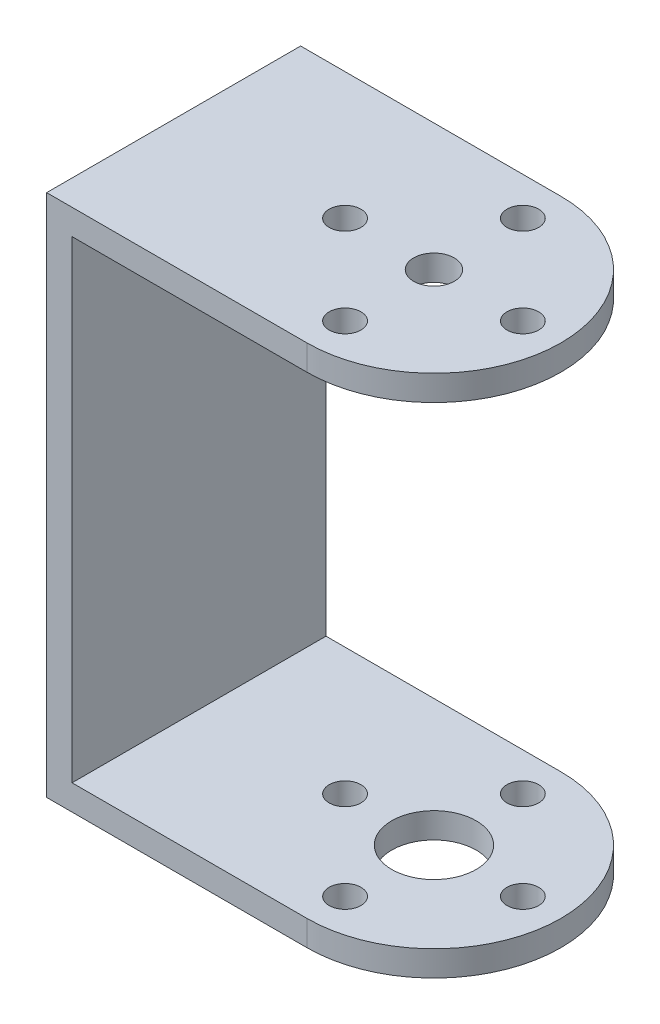
ISO-10303-21;
HEADER;
FILE_DESCRIPTION(('STEP AP214'),'2;1');
FILE_NAME('part.step','',(''),(''),'','','');
FILE_SCHEMA(('AUTOMOTIVE_DESIGN { 1 0 10303 214 1 1 1 1 }'));
ENDSEC;
DATA;
#1=APPLICATION_CONTEXT('core data for automotive mechanical design processes');
#2=APPLICATION_PROTOCOL_DEFINITION('international standard','automotive_design',2000,#1);
#3=PRODUCT_CONTEXT('',#1,'mechanical');
#4=PRODUCT('Part','Part','',(#3));
#5=PRODUCT_RELATED_PRODUCT_CATEGORY('part','',(#4));
#6=PRODUCT_DEFINITION_FORMATION('','',#4);
#7=PRODUCT_DEFINITION_CONTEXT('part definition',#1,'design');
#8=PRODUCT_DEFINITION('design','',#6,#7);
#9=PRODUCT_DEFINITION_SHAPE('','',#8);
#10=(LENGTH_UNIT() NAMED_UNIT(*) SI_UNIT(.MILLI.,.METRE.));
#11=(NAMED_UNIT(*) PLANE_ANGLE_UNIT() SI_UNIT($,.RADIAN.));
#12=(NAMED_UNIT(*) SI_UNIT($,.STERADIAN.) SOLID_ANGLE_UNIT());
#13=UNCERTAINTY_MEASURE_WITH_UNIT(LENGTH_MEASURE(1.E-05),#10,'distance_accuracy_value','');
#14=(GEOMETRIC_REPRESENTATION_CONTEXT(3) GLOBAL_UNCERTAINTY_ASSIGNED_CONTEXT((#13)) GLOBAL_UNIT_ASSIGNED_CONTEXT((#10,
#11,#12)) REPRESENTATION_CONTEXT('',''));
#15=CARTESIAN_POINT('',(0.,0.,0.));
#16=DIRECTION('',(0.,0.,1.));
#17=DIRECTION('',(1.,0.,0.));
#18=AXIS2_PLACEMENT_3D('',#15,#16,#17);
#19=CARTESIAN_POINT('',(-50.,11.6,10.0000001490116));
#20=DIRECTION('',(0.,1.,0.));
#21=DIRECTION('',(1.,0.,0.));
#22=AXIS2_PLACEMENT_3D('',#19,#20,#21);
#23=PLANE('',#22);
#24=CARTESIAN_POINT('',(-25.5,11.6,-7.0000018731));
#25=DIRECTION('',(0.,-1.,0.));
#26=DIRECTION('',(1.,0.,0.));
#27=AXIS2_PLACEMENT_3D('',#24,#25,#26);
#28=CIRCLE('',#27,1.25);
#29=CARTESIAN_POINT('',(-24.25,11.6,-7.0000018731));
#30=VERTEX_POINT('',#29);
#31=EDGE_CURVE('E240',#30,#30,#28,.T.);
#32=ORIENTED_EDGE('',*,*,#31,.T.);
#33=EDGE_LOOP('',(#32));
#34=FACE_BOUND('',#33,.T.);
#35=CARTESIAN_POINT('',(-25.5,11.6,7.0000018731));
#36=DIRECTION('',(0.,-1.,0.));
#37=DIRECTION('',(1.,0.,0.));
#38=AXIS2_PLACEMENT_3D('',#35,#36,#37);
#39=CIRCLE('',#38,1.25);
#40=CARTESIAN_POINT('',(-24.25,11.6,7.0000018731));
#41=VERTEX_POINT('',#40);
#42=EDGE_CURVE('E244',#41,#41,#39,.T.);
#43=ORIENTED_EDGE('',*,*,#42,.T.);
#44=EDGE_LOOP('',(#43));
#45=FACE_BOUND('',#44,.T.);
#46=CARTESIAN_POINT('',(-32.5000018731,11.6,0.));
#47=DIRECTION('',(0.,-1.,0.));
#48=DIRECTION('',(1.,0.,0.));
#49=AXIS2_PLACEMENT_3D('',#46,#47,#48);
#50=CIRCLE('',#49,1.25);
#51=CARTESIAN_POINT('',(-31.2500018731,11.6,0.));
#52=VERTEX_POINT('',#51);
#53=EDGE_CURVE('E266',#52,#52,#50,.T.);
#54=ORIENTED_EDGE('',*,*,#53,.T.);
#55=EDGE_LOOP('',(#54));
#56=FACE_BOUND('',#55,.T.);
#57=CARTESIAN_POINT('',(-25.5,11.6,0.));
#58=DIRECTION('',(0.,-1.,0.));
#59=DIRECTION('',(1.,0.,0.));
#60=AXIS2_PLACEMENT_3D('',#57,#58,#59);
#61=CIRCLE('',#60,1.6);
#62=CARTESIAN_POINT('',(-23.9,11.6,0.));
#63=VERTEX_POINT('',#62);
#64=EDGE_CURVE('E262',#63,#63,#61,.T.);
#65=ORIENTED_EDGE('',*,*,#64,.T.);
#66=EDGE_LOOP('',(#65));
#67=FACE_BOUND('',#66,.T.);
#68=CARTESIAN_POINT('',(-18.4999981269,11.6,0.));
#69=DIRECTION('',(0.,-1.,0.));
#70=DIRECTION('',(1.,0.,0.));
#71=AXIS2_PLACEMENT_3D('',#68,#69,#70);
#72=CIRCLE('',#71,1.25);
#73=CARTESIAN_POINT('',(-17.2499981269,11.6,0.));
#74=VERTEX_POINT('',#73);
#75=EDGE_CURVE('E258',#74,#74,#72,.T.);
#76=ORIENTED_EDGE('',*,*,#75,.T.);
#77=EDGE_LOOP('',(#76));
#78=FACE_BOUND('',#77,.T.);
#79=DIRECTION('',(1.,-3.89254814322436E-09,0.));
#80=VECTOR('',#79,1.);
#81=CARTESIAN_POINT('',(-50.,11.6000000953674,10.0000001490116));
#82=LINE('',#81,#80);
#83=CARTESIAN_POINT('',(-46.,11.6,10.0000001490116));
#84=VERTEX_POINT('',#83);
#85=CARTESIAN_POINT('',(-25.5,11.6,10.0000001490116));
#86=VERTEX_POINT('',#85);
#87=EDGE_CURVE('E223',#84,#86,#82,.T.);
#88=ORIENTED_EDGE('',*,*,#87,.T.);
#89=CARTESIAN_POINT('',(-25.5,11.6,0.));
#90=DIRECTION('',(0.,1.,0.));
#91=DIRECTION('',(-1.,0.,0.));
#92=AXIS2_PLACEMENT_3D('',#89,#90,#91);
#93=CIRCLE('',#92,10.);
#94=CARTESIAN_POINT('',(-25.5,11.6,-10.));
#95=VERTEX_POINT('',#94);
#96=EDGE_CURVE('E10',#86,#95,#93,.T.);
#97=ORIENTED_EDGE('',*,*,#96,.T.);
#98=DIRECTION('',(-1.,0.,0.));
#99=VECTOR('',#98,1.);
#100=CARTESIAN_POINT('',(-44.,11.6,-10.0000001490116));
#101=LINE('',#100,#99);
#102=CARTESIAN_POINT('',(-46.,11.6,-10.0000001490116));
#103=VERTEX_POINT('',#102);
#104=EDGE_CURVE('E36',#95,#103,#101,.T.);
#105=ORIENTED_EDGE('',*,*,#104,.T.);
#106=DIRECTION('',(0.,0.,-1.));
#107=VECTOR('',#106,1.);
#108=CARTESIAN_POINT('',(-46.,11.6,-10.0000001490116));
#109=LINE('',#108,#107);
#110=EDGE_CURVE('E212',#84,#103,#109,.T.);
#111=ORIENTED_EDGE('',*,*,#110,.F.);
#112=EDGE_LOOP('',(#88,#97,#105,#111));
#113=FACE_BOUND('',#112,.T.);
#114=ADVANCED_FACE('F16',(#34,#45,#56,#67,#78,#113),#23,.T.);
#115=CARTESIAN_POINT('',(-25.5,9.6,0.));
#116=DIRECTION('',(0.,1.,0.));
#117=DIRECTION('',(1.,0.,0.));
#118=AXIS2_PLACEMENT_3D('',#115,#116,#117);
#119=CYLINDRICAL_SURFACE('',#118,10.);
#120=CARTESIAN_POINT('',(-25.5,9.6,0.));
#121=DIRECTION('',(0.,1.,0.));
#122=DIRECTION('',(-1.,0.,0.));
#123=AXIS2_PLACEMENT_3D('',#120,#121,#122);
#124=CIRCLE('',#123,10.);
#125=CARTESIAN_POINT('',(-25.5,9.6,10.0000001490116));
#126=VERTEX_POINT('',#125);
#127=CARTESIAN_POINT('',(-25.5,9.6,-10.));
#128=VERTEX_POINT('',#127);
#129=EDGE_CURVE('E236',#126,#128,#124,.T.);
#130=ORIENTED_EDGE('',*,*,#129,.T.);
#131=DIRECTION('',(0.,1.,0.));
#132=VECTOR('',#131,1.);
#133=CARTESIAN_POINT('',(-25.5,9.6,-10.));
#134=LINE('',#133,#132);
#135=EDGE_CURVE('E24',#128,#95,#134,.T.);
#136=ORIENTED_EDGE('',*,*,#135,.T.);
#137=ORIENTED_EDGE('',*,*,#96,.F.);
#138=DIRECTION('',(0.,1.,0.));
#139=VECTOR('',#138,1.);
#140=CARTESIAN_POINT('',(-25.5,9.6,10.0000001490116));
#141=LINE('',#140,#139);
#142=EDGE_CURVE('E219',#126,#86,#141,.T.);
#143=ORIENTED_EDGE('',*,*,#142,.F.);
#144=EDGE_LOOP('',(#130,#136,#137,#143));
#145=FACE_BOUND('',#144,.T.);
#146=ADVANCED_FACE('F276',(#145),#119,.T.);
#147=CARTESIAN_POINT('',(-25.5,9.6,-7.0000018731));
#148=DIRECTION('',(0.,1.,0.));
#149=DIRECTION('',(1.,0.,0.));
#150=AXIS2_PLACEMENT_3D('',#147,#148,#149);
#151=CYLINDRICAL_SURFACE('',#150,1.25);
#152=CARTESIAN_POINT('',(-25.5,9.6,-7.0000018731));
#153=DIRECTION('',(0.,-1.,0.));
#154=DIRECTION('',(1.,0.,0.));
#155=AXIS2_PLACEMENT_3D('',#152,#153,#154);
#156=CIRCLE('',#155,1.25);
#157=CARTESIAN_POINT('',(-24.25,9.6,-7.0000018731));
#158=VERTEX_POINT('',#157);
#159=EDGE_CURVE('E254',#158,#158,#156,.T.);
#160=ORIENTED_EDGE('',*,*,#159,.T.);
#161=EDGE_LOOP('',(#160));
#162=FACE_BOUND('',#161,.T.);
#163=ORIENTED_EDGE('',*,*,#31,.F.);
#164=EDGE_LOOP('',(#163));
#165=FACE_BOUND('',#164,.T.);
#166=ADVANCED_FACE('F299',(#162,#165),#151,.F.);
#167=CARTESIAN_POINT('',(-25.5,9.6,7.0000018731));
#168=DIRECTION('',(0.,1.,0.));
#169=DIRECTION('',(1.,0.,0.));
#170=AXIS2_PLACEMENT_3D('',#167,#168,#169);
#171=CYLINDRICAL_SURFACE('',#170,1.25);
#172=CARTESIAN_POINT('',(-25.5,9.6,7.0000018731));
#173=DIRECTION('',(0.,-1.,0.));
#174=DIRECTION('',(1.,0.,0.));
#175=AXIS2_PLACEMENT_3D('',#172,#173,#174);
#176=CIRCLE('',#175,1.25);
#177=CARTESIAN_POINT('',(-24.25,9.6,7.0000018731));
#178=VERTEX_POINT('',#177);
#179=EDGE_CURVE('E232',#178,#178,#176,.T.);
#180=ORIENTED_EDGE('',*,*,#179,.T.);
#181=EDGE_LOOP('',(#180));
#182=FACE_BOUND('',#181,.T.);
#183=ORIENTED_EDGE('',*,*,#42,.F.);
#184=EDGE_LOOP('',(#183));
#185=FACE_BOUND('',#184,.T.);
#186=ADVANCED_FACE('F329',(#182,#185),#171,.F.);
#187=CARTESIAN_POINT('',(-32.5000018731,9.6,0.));
#188=DIRECTION('',(0.,1.,0.));
#189=DIRECTION('',(1.,0.,0.));
#190=AXIS2_PLACEMENT_3D('',#187,#188,#189);
#191=CYLINDRICAL_SURFACE('',#190,1.25);
#192=CARTESIAN_POINT('',(-32.5000018731,9.6,0.));
#193=DIRECTION('',(0.,-1.,0.));
#194=DIRECTION('',(1.,0.,0.));
#195=AXIS2_PLACEMENT_3D('',#192,#193,#194);
#196=CIRCLE('',#195,1.25);
#197=CARTESIAN_POINT('',(-31.2500018731,9.6,0.));
#198=VERTEX_POINT('',#197);
#199=EDGE_CURVE('E228',#198,#198,#196,.T.);
#200=ORIENTED_EDGE('',*,*,#199,.T.);
#201=EDGE_LOOP('',(#200));
#202=FACE_BOUND('',#201,.T.);
#203=ORIENTED_EDGE('',*,*,#53,.F.);
#204=EDGE_LOOP('',(#203));
#205=FACE_BOUND('',#204,.T.);
#206=ADVANCED_FACE('F322',(#202,#205),#191,.F.);
#207=CARTESIAN_POINT('',(-25.5,9.6,0.));
#208=DIRECTION('',(0.,1.,0.));
#209=DIRECTION('',(1.,0.,0.));
#210=AXIS2_PLACEMENT_3D('',#207,#208,#209);
#211=CYLINDRICAL_SURFACE('',#210,1.6);
#212=CARTESIAN_POINT('',(-25.5,9.6,0.));
#213=DIRECTION('',(0.,-1.,0.));
#214=DIRECTION('',(1.,0.,0.));
#215=AXIS2_PLACEMENT_3D('',#212,#213,#214);
#216=CIRCLE('',#215,1.6);
#217=CARTESIAN_POINT('',(-23.9,9.6,0.));
#218=VERTEX_POINT('',#217);
#219=EDGE_CURVE('E233',#218,#218,#216,.T.);
#220=ORIENTED_EDGE('',*,*,#219,.T.);
#221=EDGE_LOOP('',(#220));
#222=FACE_BOUND('',#221,.T.);
#223=ORIENTED_EDGE('',*,*,#64,.F.);
#224=EDGE_LOOP('',(#223));
#225=FACE_BOUND('',#224,.T.);
#226=ADVANCED_FACE('F312',(#222,#225),#211,.F.);
#227=CARTESIAN_POINT('',(-18.4999981269,9.6,0.));
#228=DIRECTION('',(0.,1.,0.));
#229=DIRECTION('',(1.,0.,0.));
#230=AXIS2_PLACEMENT_3D('',#227,#228,#229);
#231=CYLINDRICAL_SURFACE('',#230,1.25);
#232=CARTESIAN_POINT('',(-18.4999981269,9.6,0.));
#233=DIRECTION('',(0.,-1.,0.));
#234=DIRECTION('',(1.,0.,0.));
#235=AXIS2_PLACEMENT_3D('',#232,#233,#234);
#236=CIRCLE('',#235,1.25);
#237=CARTESIAN_POINT('',(-17.2499981269,9.6,0.));
#238=VERTEX_POINT('',#237);
#239=EDGE_CURVE('E239',#238,#238,#236,.T.);
#240=ORIENTED_EDGE('',*,*,#239,.T.);
#241=EDGE_LOOP('',(#240));
#242=FACE_BOUND('',#241,.T.);
#243=ORIENTED_EDGE('',*,*,#75,.F.);
#244=EDGE_LOOP('',(#243));
#245=FACE_BOUND('',#244,.T.);
#246=ADVANCED_FACE('F310',(#242,#245),#231,.F.);
#247=CARTESIAN_POINT('',(-33.75,9.60000009536743,0.));
#248=DIRECTION('',(0.,1.,0.));
#249=DIRECTION('',(1.,0.,0.));
#250=AXIS2_PLACEMENT_3D('',#247,#248,#249);
#251=PLANE('',#250);
#252=ORIENTED_EDGE('',*,*,#159,.F.);
#253=EDGE_LOOP('',(#252));
#254=FACE_BOUND('',#253,.T.);
#255=ORIENTED_EDGE('',*,*,#179,.F.);
#256=EDGE_LOOP('',(#255));
#257=FACE_BOUND('',#256,.T.);
#258=ORIENTED_EDGE('',*,*,#199,.F.);
#259=EDGE_LOOP('',(#258));
#260=FACE_BOUND('',#259,.T.);
#261=ORIENTED_EDGE('',*,*,#219,.F.);
#262=EDGE_LOOP('',(#261));
#263=FACE_BOUND('',#262,.T.);
#264=ORIENTED_EDGE('',*,*,#239,.F.);
#265=EDGE_LOOP('',(#264));
#266=FACE_BOUND('',#265,.T.);
#267=DIRECTION('',(0.,0.,-1.));
#268=VECTOR('',#267,1.);
#269=CARTESIAN_POINT('',(-44.,9.60000009536743,0.));
#270=LINE('',#269,#268);
#271=CARTESIAN_POINT('',(-44.,9.60000009536743,10.0000001490116));
#272=VERTEX_POINT('',#271);
#273=CARTESIAN_POINT('',(-44.,9.60000009536743,-10.0000001490116));
#274=VERTEX_POINT('',#273);
#275=EDGE_CURVE('E109',#272,#274,#270,.T.);
#276=ORIENTED_EDGE('',*,*,#275,.T.);
#277=DIRECTION('',(-1.,3.89254814322436E-09,-6.08210660973374E-09));
#278=VECTOR('',#277,1.);
#279=CARTESIAN_POINT('',(-25.5,9.6,-10.));
#280=LINE('',#279,#278);
#281=EDGE_CURVE('E227',#128,#274,#280,.T.);
#282=ORIENTED_EDGE('',*,*,#281,.F.);
#283=ORIENTED_EDGE('',*,*,#129,.F.);
#284=DIRECTION('',(1.,-3.89254814322436E-09,0.));
#285=VECTOR('',#284,1.);
#286=CARTESIAN_POINT('',(-50.,9.60000009536743,10.0000001490116));
#287=LINE('',#286,#285);
#288=EDGE_CURVE('E113',#272,#126,#287,.T.);
#289=ORIENTED_EDGE('',*,*,#288,.F.);
#290=EDGE_LOOP('',(#276,#282,#283,#289));
#291=FACE_BOUND('',#290,.T.);
#292=ADVANCED_FACE('F280',(#254,#257,#260,#263,#266,#291),#251,.F.);
#293=CARTESIAN_POINT('',(-25.5,-27.65,10.0000001490116));
#294=DIRECTION('',(0.,0.,1.));
#295=DIRECTION('',(1.,0.,0.));
#296=AXIS2_PLACEMENT_3D('',#293,#294,#295);
#297=PLANE('',#296);
#298=ORIENTED_EDGE('',*,*,#288,.T.);
#299=ORIENTED_EDGE('',*,*,#142,.T.);
#300=ORIENTED_EDGE('',*,*,#87,.F.);
#301=DIRECTION('',(0.,1.,0.));
#302=VECTOR('',#301,1.);
#303=CARTESIAN_POINT('',(-46.,11.6,10.0000001490116));
#304=LINE('',#303,#302);
#305=CARTESIAN_POINT('',(-46.,-29.65,10.0000001490116));
#306=VERTEX_POINT('',#305);
#307=EDGE_CURVE('E208',#306,#84,#304,.T.);
#308=ORIENTED_EDGE('',*,*,#307,.F.);
#309=DIRECTION('',(-1.,0.,0.));
#310=VECTOR('',#309,1.);
#311=CARTESIAN_POINT('',(-25.5,-29.65,10.0000001490116));
#312=LINE('',#311,#310);
#313=CARTESIAN_POINT('',(-25.5,-29.65,10.0000001490116));
#314=VERTEX_POINT('',#313);
#315=EDGE_CURVE('E188',#314,#306,#312,.T.);
#316=ORIENTED_EDGE('',*,*,#315,.F.);
#317=DIRECTION('',(0.,-1.,0.));
#318=VECTOR('',#317,1.);
#319=CARTESIAN_POINT('',(-25.5,-27.65,10.0000001490116));
#320=LINE('',#319,#318);
#321=CARTESIAN_POINT('',(-25.5,-27.65,10.0000001490116));
#322=VERTEX_POINT('',#321);
#323=EDGE_CURVE('E119',#322,#314,#320,.T.);
#324=ORIENTED_EDGE('',*,*,#323,.F.);
#325=DIRECTION('',(-1.,0.,0.));
#326=VECTOR('',#325,1.);
#327=CARTESIAN_POINT('',(-25.5,-27.65,10.0000001490116));
#328=LINE('',#327,#326);
#329=CARTESIAN_POINT('',(-44.,-27.6499982833864,10.0000001490116));
#330=VERTEX_POINT('',#329);
#331=EDGE_CURVE('E116',#322,#330,#328,.T.);
#332=ORIENTED_EDGE('',*,*,#331,.T.);
#333=DIRECTION('',(0.,-1.,0.));
#334=VECTOR('',#333,1.);
#335=CARTESIAN_POINT('',(-44.,11.6,10.0000001490116));
#336=LINE('',#335,#334);
#337=EDGE_CURVE('E102',#272,#330,#336,.T.);
#338=ORIENTED_EDGE('',*,*,#337,.F.);
#339=EDGE_LOOP('',(#298,#299,#300,#308,#316,#324,#332,#338));
#340=FACE_BOUND('',#339,.T.);
#341=ADVANCED_FACE('F117',(#340),#297,.T.);
#342=CARTESIAN_POINT('',(-44.,-9.02500000000012,0.));
#343=DIRECTION('',(-1.,0.,0.));
#344=DIRECTION('',(0.,0.,1.));
#345=AXIS2_PLACEMENT_3D('',#342,#343,#344);
#346=PLANE('',#345);
#347=ORIENTED_EDGE('',*,*,#275,.F.);
#348=ORIENTED_EDGE('',*,*,#337,.T.);
#349=DIRECTION('',(0.,0.,-1.));
#350=VECTOR('',#349,1.);
#351=CARTESIAN_POINT('',(-44.,-27.6499982833864,0.));
#352=LINE('',#351,#350);
#353=CARTESIAN_POINT('',(-44.,-27.6499982833864,-10.0000001490116));
#354=VERTEX_POINT('',#353);
#355=EDGE_CURVE('E107',#330,#354,#352,.T.);
#356=ORIENTED_EDGE('',*,*,#355,.T.);
#357=DIRECTION('',(0.,1.,0.));
#358=VECTOR('',#357,1.);
#359=CARTESIAN_POINT('',(-44.,-29.65,-10.0000001490116));
#360=LINE('',#359,#358);
#361=EDGE_CURVE('E205',#354,#274,#360,.T.);
#362=ORIENTED_EDGE('',*,*,#361,.T.);
#363=EDGE_LOOP('',(#347,#348,#356,#362));
#364=FACE_BOUND('',#363,.T.);
#365=ADVANCED_FACE('F104',(#364),#346,.F.);
#366=CARTESIAN_POINT('',(-46.,-9.02500000000012,0.));
#367=DIRECTION('',(-1.,0.,0.));
#368=DIRECTION('',(0.,0.,1.));
#369=AXIS2_PLACEMENT_3D('',#366,#367,#368);
#370=PLANE('',#369);
#371=ORIENTED_EDGE('',*,*,#307,.T.);
#372=ORIENTED_EDGE('',*,*,#110,.T.);
#373=DIRECTION('',(0.,-1.,0.));
#374=VECTOR('',#373,1.);
#375=CARTESIAN_POINT('',(-46.,-29.65,-10.0000001490116));
#376=LINE('',#375,#374);
#377=CARTESIAN_POINT('',(-46.,-29.65,-10.0000001490116));
#378=VERTEX_POINT('',#377);
#379=EDGE_CURVE('E200',#103,#378,#376,.T.);
#380=ORIENTED_EDGE('',*,*,#379,.T.);
#381=DIRECTION('',(0.,0.,1.));
#382=VECTOR('',#381,1.);
#383=CARTESIAN_POINT('',(-46.,-29.65,10.0000001490116));
#384=LINE('',#383,#382);
#385=EDGE_CURVE('E192',#378,#306,#384,.T.);
#386=ORIENTED_EDGE('',*,*,#385,.T.);
#387=EDGE_LOOP('',(#371,#372,#380,#386));
#388=FACE_BOUND('',#387,.T.);
#389=ADVANCED_FACE('F289',(#388),#370,.T.);
#390=CARTESIAN_POINT('',(-44.,11.6,-10.0000001490116));
#391=DIRECTION('',(0.,0.,-1.));
#392=DIRECTION('',(0.,-1.,0.));
#393=AXIS2_PLACEMENT_3D('',#390,#391,#392);
#394=PLANE('',#393);
#395=DIRECTION('',(-1.,0.,0.));
#396=VECTOR('',#395,1.);
#397=CARTESIAN_POINT('',(-44.,-29.65,-10.0000001490116));
#398=LINE('',#397,#396);
#399=CARTESIAN_POINT('',(-25.5,-29.65,-10.0000001490116));
#400=VERTEX_POINT('',#399);
#401=EDGE_CURVE('E196',#400,#378,#398,.T.);
#402=ORIENTED_EDGE('',*,*,#401,.T.);
#403=ORIENTED_EDGE('',*,*,#379,.F.);
#404=ORIENTED_EDGE('',*,*,#104,.F.);
#405=ORIENTED_EDGE('',*,*,#135,.F.);
#406=ORIENTED_EDGE('',*,*,#281,.T.);
#407=ORIENTED_EDGE('',*,*,#361,.F.);
#408=DIRECTION('',(-1.,0.,0.));
#409=VECTOR('',#408,1.);
#410=CARTESIAN_POINT('',(-25.5,-27.65,-10.0000001490116));
#411=LINE('',#410,#409);
#412=CARTESIAN_POINT('',(-25.5,-27.65,-10.0000001490116));
#413=VERTEX_POINT('',#412);
#414=EDGE_CURVE('E129',#413,#354,#411,.T.);
#415=ORIENTED_EDGE('',*,*,#414,.F.);
#416=DIRECTION('',(0.,-1.,0.));
#417=VECTOR('',#416,1.);
#418=CARTESIAN_POINT('',(-25.5,-27.65,-10.0000001490116));
#419=LINE('',#418,#417);
#420=EDGE_CURVE('E166',#413,#400,#419,.T.);
#421=ORIENTED_EDGE('',*,*,#420,.T.);
#422=EDGE_LOOP('',(#402,#403,#404,#405,#406,#407,#415,#421));
#423=FACE_BOUND('',#422,.T.);
#424=ADVANCED_FACE('F281',(#423),#394,.T.);
#425=CARTESIAN_POINT('',(-44.,-29.65,-10.0000001490116));
#426=DIRECTION('',(0.,-1.,0.));
#427=DIRECTION('',(0.,0.,-1.));
#428=AXIS2_PLACEMENT_3D('',#425,#426,#427);
#429=PLANE('',#428);
#430=CARTESIAN_POINT('',(-18.5000018730999,-29.65,0.));
#431=DIRECTION('',(0.,1.,0.));
#432=DIRECTION('',(-1.,0.,0.));
#433=AXIS2_PLACEMENT_3D('',#430,#431,#432);
#434=CIRCLE('',#433,1.25);
#435=CARTESIAN_POINT('',(-19.7500018730999,-29.65,0.));
#436=VERTEX_POINT('',#435);
#437=EDGE_CURVE('E147',#436,#436,#434,.T.);
#438=ORIENTED_EDGE('',*,*,#437,.T.);
#439=EDGE_LOOP('',(#438));
#440=FACE_BOUND('',#439,.T.);
#441=CARTESIAN_POINT('',(-25.5,-29.65,0.));
#442=DIRECTION('',(0.,1.,0.));
#443=DIRECTION('',(-1.,0.,0.));
#444=AXIS2_PLACEMENT_3D('',#441,#442,#443);
#445=CIRCLE('',#444,3.325000000003);
#446=CARTESIAN_POINT('',(-28.825000000003,-29.65,0.));
#447=VERTEX_POINT('',#446);
#448=EDGE_CURVE('E143',#447,#447,#445,.T.);
#449=ORIENTED_EDGE('',*,*,#448,.T.);
#450=EDGE_LOOP('',(#449));
#451=FACE_BOUND('',#450,.T.);
#452=CARTESIAN_POINT('',(-32.4999981268999,-29.65,0.));
#453=DIRECTION('',(0.,1.,0.));
#454=DIRECTION('',(-1.,0.,0.));
#455=AXIS2_PLACEMENT_3D('',#452,#453,#454);
#456=CIRCLE('',#455,1.25);
#457=CARTESIAN_POINT('',(-33.7499981268999,-29.65,0.));
#458=VERTEX_POINT('',#457);
#459=EDGE_CURVE('E148',#458,#458,#456,.T.);
#460=ORIENTED_EDGE('',*,*,#459,.T.);
#461=EDGE_LOOP('',(#460));
#462=FACE_BOUND('',#461,.T.);
#463=CARTESIAN_POINT('',(-25.5,-29.65,-6.9999981269));
#464=DIRECTION('',(0.,1.,0.));
#465=DIRECTION('',(-1.,0.,0.));
#466=AXIS2_PLACEMENT_3D('',#463,#464,#465);
#467=CIRCLE('',#466,1.25);
#468=CARTESIAN_POINT('',(-26.75,-29.65,-6.9999981269));
#469=VERTEX_POINT('',#468);
#470=EDGE_CURVE('E165',#469,#469,#467,.T.);
#471=ORIENTED_EDGE('',*,*,#470,.T.);
#472=EDGE_LOOP('',(#471));
#473=FACE_BOUND('',#472,.T.);
#474=CARTESIAN_POINT('',(-25.5,-29.65,6.9999981269));
#475=DIRECTION('',(0.,1.,0.));
#476=DIRECTION('',(-1.,0.,0.));
#477=AXIS2_PLACEMENT_3D('',#474,#475,#476);
#478=CIRCLE('',#477,1.25);
#479=CARTESIAN_POINT('',(-26.75,-29.65,6.9999981269));
#480=VERTEX_POINT('',#479);
#481=EDGE_CURVE('E161',#480,#480,#478,.T.);
#482=ORIENTED_EDGE('',*,*,#481,.T.);
#483=EDGE_LOOP('',(#482));
#484=FACE_BOUND('',#483,.T.);
#485=ORIENTED_EDGE('',*,*,#315,.T.);
#486=ORIENTED_EDGE('',*,*,#385,.F.);
#487=ORIENTED_EDGE('',*,*,#401,.F.);
#488=CARTESIAN_POINT('',(-25.5,-29.65,0.));
#489=DIRECTION('',(0.,-1.,0.));
#490=DIRECTION('',(1.,0.,0.));
#491=AXIS2_PLACEMENT_3D('',#488,#489,#490);
#492=CIRCLE('',#491,10.);
#493=EDGE_CURVE('E175',#400,#314,#492,.T.);
#494=ORIENTED_EDGE('',*,*,#493,.T.);
#495=EDGE_LOOP('',(#485,#486,#487,#494));
#496=FACE_BOUND('',#495,.T.);
#497=ADVANCED_FACE('F286',(#440,#451,#462,#473,#484,#496),#429,.T.);
#498=CARTESIAN_POINT('',(-18.5000018731,-27.65,0.));
#499=DIRECTION('',(0.,-1.,0.));
#500=DIRECTION('',(-1.,0.,0.));
#501=AXIS2_PLACEMENT_3D('',#498,#499,#500);
#502=CYLINDRICAL_SURFACE('',#501,1.25);
#503=CARTESIAN_POINT('',(-18.5000018731,-27.65,0.));
#504=DIRECTION('',(0.,1.,0.));
#505=DIRECTION('',(-1.,0.,0.));
#506=AXIS2_PLACEMENT_3D('',#503,#504,#505);
#507=CIRCLE('',#506,1.25);
#508=CARTESIAN_POINT('',(-19.7500018731,-27.65,0.));
#509=VERTEX_POINT('',#508);
#510=EDGE_CURVE('E160',#509,#509,#507,.T.);
#511=ORIENTED_EDGE('',*,*,#510,.T.);
#512=EDGE_LOOP('',(#511));
#513=FACE_BOUND('',#512,.T.);
#514=ORIENTED_EDGE('',*,*,#437,.F.);
#515=EDGE_LOOP('',(#514));
#516=FACE_BOUND('',#515,.T.);
#517=ADVANCED_FACE('F432',(#513,#516),#502,.F.);
#518=CARTESIAN_POINT('',(-25.5,-27.65,0.));
#519=DIRECTION('',(0.,-1.,0.));
#520=DIRECTION('',(-1.,0.,0.));
#521=AXIS2_PLACEMENT_3D('',#518,#519,#520);
#522=CYLINDRICAL_SURFACE('',#521,3.325000000003);
#523=CARTESIAN_POINT('',(-25.5,-27.65,0.));
#524=DIRECTION('',(0.,1.,0.));
#525=DIRECTION('',(-1.,0.,0.));
#526=AXIS2_PLACEMENT_3D('',#523,#524,#525);
#527=CIRCLE('',#526,3.325000000003);
#528=CARTESIAN_POINT('',(-28.825000000003,-27.65,0.));
#529=VERTEX_POINT('',#528);
#530=EDGE_CURVE('E156',#529,#529,#527,.T.);
#531=ORIENTED_EDGE('',*,*,#530,.T.);
#532=EDGE_LOOP('',(#531));
#533=FACE_BOUND('',#532,.T.);
#534=ORIENTED_EDGE('',*,*,#448,.F.);
#535=EDGE_LOOP('',(#534));
#536=FACE_BOUND('',#535,.T.);
#537=ADVANCED_FACE('F443',(#533,#536),#522,.F.);
#538=CARTESIAN_POINT('',(-32.4999981269,-27.65,0.));
#539=DIRECTION('',(0.,-1.,0.));
#540=DIRECTION('',(-1.,0.,0.));
#541=AXIS2_PLACEMENT_3D('',#538,#539,#540);
#542=CYLINDRICAL_SURFACE('',#541,1.25);
#543=CARTESIAN_POINT('',(-32.4999981269,-27.65,0.));
#544=DIRECTION('',(0.,1.,0.));
#545=DIRECTION('',(-1.,0.,0.));
#546=AXIS2_PLACEMENT_3D('',#543,#544,#545);
#547=CIRCLE('',#546,1.25);
#548=CARTESIAN_POINT('',(-33.7499981269,-27.65,0.));
#549=VERTEX_POINT('',#548);
#550=EDGE_CURVE('E137',#549,#549,#547,.T.);
#551=ORIENTED_EDGE('',*,*,#550,.T.);
#552=EDGE_LOOP('',(#551));
#553=FACE_BOUND('',#552,.T.);
#554=ORIENTED_EDGE('',*,*,#459,.F.);
#555=EDGE_LOOP('',(#554));
#556=FACE_BOUND('',#555,.T.);
#557=ADVANCED_FACE('F454',(#553,#556),#542,.F.);
#558=CARTESIAN_POINT('',(-25.5,-27.65,-6.9999981269));
#559=DIRECTION('',(0.,-1.,0.));
#560=DIRECTION('',(-1.,0.,0.));
#561=AXIS2_PLACEMENT_3D('',#558,#559,#560);
#562=CYLINDRICAL_SURFACE('',#561,1.25);
#563=CARTESIAN_POINT('',(-25.5,-27.65,-6.9999981269));
#564=DIRECTION('',(0.,1.,0.));
#565=DIRECTION('',(-1.,0.,0.));
#566=AXIS2_PLACEMENT_3D('',#563,#564,#565);
#567=CIRCLE('',#566,1.25);
#568=CARTESIAN_POINT('',(-26.75,-27.65,-6.9999981269));
#569=VERTEX_POINT('',#568);
#570=EDGE_CURVE('E152',#569,#569,#567,.T.);
#571=ORIENTED_EDGE('',*,*,#570,.T.);
#572=EDGE_LOOP('',(#571));
#573=FACE_BOUND('',#572,.T.);
#574=ORIENTED_EDGE('',*,*,#470,.F.);
#575=EDGE_LOOP('',(#574));
#576=FACE_BOUND('',#575,.T.);
#577=ADVANCED_FACE('F465',(#573,#576),#562,.F.);
#578=CARTESIAN_POINT('',(-25.5,-27.65,6.9999981269));
#579=DIRECTION('',(0.,-1.,0.));
#580=DIRECTION('',(-1.,0.,0.));
#581=AXIS2_PLACEMENT_3D('',#578,#579,#580);
#582=CYLINDRICAL_SURFACE('',#581,1.25);
#583=CARTESIAN_POINT('',(-25.5,-27.65,6.9999981269));
#584=DIRECTION('',(0.,1.,0.));
#585=DIRECTION('',(-1.,0.,0.));
#586=AXIS2_PLACEMENT_3D('',#583,#584,#585);
#587=CIRCLE('',#586,1.25);
#588=CARTESIAN_POINT('',(-26.75,-27.65,6.9999981269));
#589=VERTEX_POINT('',#588);
#590=EDGE_CURVE('E139',#589,#589,#587,.T.);
#591=ORIENTED_EDGE('',*,*,#590,.T.);
#592=EDGE_LOOP('',(#591));
#593=FACE_BOUND('',#592,.T.);
#594=ORIENTED_EDGE('',*,*,#481,.F.);
#595=EDGE_LOOP('',(#594));
#596=FACE_BOUND('',#595,.T.);
#597=ADVANCED_FACE('F476',(#593,#596),#582,.F.);
#598=CARTESIAN_POINT('',(-25.5,-27.65,0.));
#599=DIRECTION('',(0.,-1.,0.));
#600=DIRECTION('',(1.,0.,0.));
#601=AXIS2_PLACEMENT_3D('',#598,#599,#600);
#602=CYLINDRICAL_SURFACE('',#601,10.);
#603=CARTESIAN_POINT('',(-25.5,-27.65,0.));
#604=DIRECTION('',(0.,-1.,0.));
#605=DIRECTION('',(1.,0.,0.));
#606=AXIS2_PLACEMENT_3D('',#603,#604,#605);
#607=CIRCLE('',#606,10.);
#608=EDGE_CURVE('E124',#413,#322,#607,.T.);
#609=ORIENTED_EDGE('',*,*,#608,.T.);
#610=ORIENTED_EDGE('',*,*,#323,.T.);
#611=ORIENTED_EDGE('',*,*,#493,.F.);
#612=ORIENTED_EDGE('',*,*,#420,.F.);
#613=EDGE_LOOP('',(#609,#610,#611,#612));
#614=FACE_BOUND('',#613,.T.);
#615=ADVANCED_FACE('F284',(#614),#602,.T.);
#616=CARTESIAN_POINT('',(-32.75,-27.6499982833864,0.));
#617=DIRECTION('',(0.,-1.,0.));
#618=DIRECTION('',(0.,0.,-1.));
#619=AXIS2_PLACEMENT_3D('',#616,#617,#618);
#620=PLANE('',#619);
#621=ORIENTED_EDGE('',*,*,#510,.F.);
#622=EDGE_LOOP('',(#621));
#623=FACE_BOUND('',#622,.T.);
#624=ORIENTED_EDGE('',*,*,#530,.F.);
#625=EDGE_LOOP('',(#624));
#626=FACE_BOUND('',#625,.T.);
#627=ORIENTED_EDGE('',*,*,#550,.F.);
#628=EDGE_LOOP('',(#627));
#629=FACE_BOUND('',#628,.T.);
#630=ORIENTED_EDGE('',*,*,#570,.F.);
#631=EDGE_LOOP('',(#630));
#632=FACE_BOUND('',#631,.T.);
#633=ORIENTED_EDGE('',*,*,#590,.F.);
#634=EDGE_LOOP('',(#633));
#635=FACE_BOUND('',#634,.T.);
#636=ORIENTED_EDGE('',*,*,#355,.F.);
#637=ORIENTED_EDGE('',*,*,#331,.F.);
#638=ORIENTED_EDGE('',*,*,#608,.F.);
#639=ORIENTED_EDGE('',*,*,#414,.T.);
#640=EDGE_LOOP('',(#636,#637,#638,#639));
#641=FACE_BOUND('',#640,.T.);
#642=ADVANCED_FACE('F127',(#623,#626,#629,#632,#635,#641),#620,.F.);
#643=CLOSED_SHELL('',(#114,#146,#166,#186,#206,#226,#246,#292,#341,#365,#389,#424,#497,#517,
#537,#557,#577,#597,#615,#642));
#644=MANIFOLD_SOLID_BREP('B1',#643);
#645=ADVANCED_BREP_SHAPE_REPRESENTATION('',(#18,#644),#14);
#646=SHAPE_DEFINITION_REPRESENTATION(#9,#645);
ENDSEC;
END-ISO-10303-21;
